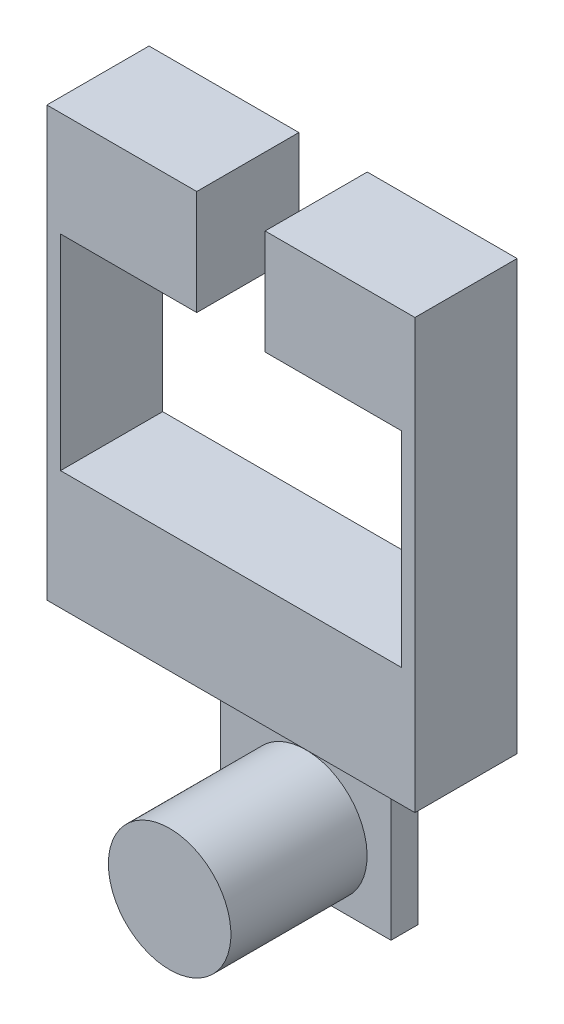
ISO-10303-21;
HEADER;
FILE_DESCRIPTION(('STEP AP214'),'2;1');
FILE_NAME('part.step','',(''),(''),'','','');
FILE_SCHEMA(('AUTOMOTIVE_DESIGN { 1 0 10303 214 1 1 1 1 }'));
ENDSEC;
DATA;
#1=APPLICATION_CONTEXT('core data for automotive mechanical design processes');
#2=APPLICATION_PROTOCOL_DEFINITION('international standard','automotive_design',2000,#1);
#3=PRODUCT_CONTEXT('',#1,'mechanical');
#4=PRODUCT('Part','Part','',(#3));
#5=PRODUCT_RELATED_PRODUCT_CATEGORY('part','',(#4));
#6=PRODUCT_DEFINITION_FORMATION('','',#4);
#7=PRODUCT_DEFINITION_CONTEXT('part definition',#1,'design');
#8=PRODUCT_DEFINITION('design','',#6,#7);
#9=PRODUCT_DEFINITION_SHAPE('','',#8);
#10=(LENGTH_UNIT() NAMED_UNIT(*) SI_UNIT(.MILLI.,.METRE.));
#11=(NAMED_UNIT(*) PLANE_ANGLE_UNIT() SI_UNIT($,.RADIAN.));
#12=(NAMED_UNIT(*) SI_UNIT($,.STERADIAN.) SOLID_ANGLE_UNIT());
#13=UNCERTAINTY_MEASURE_WITH_UNIT(LENGTH_MEASURE(1.E-05),#10,'distance_accuracy_value','');
#14=(GEOMETRIC_REPRESENTATION_CONTEXT(3) GLOBAL_UNCERTAINTY_ASSIGNED_CONTEXT((#13)) GLOBAL_UNIT_ASSIGNED_CONTEXT((#10,
#11,#12)) REPRESENTATION_CONTEXT('',''));
#15=CARTESIAN_POINT('',(0.,0.,0.));
#16=DIRECTION('',(0.,0.,1.));
#17=DIRECTION('',(1.,0.,0.));
#18=AXIS2_PLACEMENT_3D('',#15,#16,#17);
#19=CARTESIAN_POINT('',(-34.32048,0.,9.525));
#20=DIRECTION('',(0.,1.,0.));
#21=DIRECTION('',(0.,0.,1.));
#22=AXIS2_PLACEMENT_3D('',#19,#20,#21);
#23=PLANE('',#22);
#24=DIRECTION('',(0.,0.,-1.));
#25=VECTOR('',#24,1.);
#26=CARTESIAN_POINT('',(-15.875,0.,-4.445));
#27=LINE('',#26,#25);
#28=CARTESIAN_POINT('',(-15.875,0.,-4.445));
#29=VERTEX_POINT('',#28);
#30=CARTESIAN_POINT('',(-15.875,0.,-9.525));
#31=VERTEX_POINT('',#30);
#32=EDGE_CURVE('E193',#29,#31,#27,.T.);
#33=ORIENTED_EDGE('',*,*,#32,.F.);
#34=DIRECTION('',(1.,0.,0.));
#35=VECTOR('',#34,1.);
#36=CARTESIAN_POINT('',(15.875,0.,-4.445));
#37=LINE('',#36,#35);
#38=CARTESIAN_POINT('',(15.875,0.,-4.445));
#39=VERTEX_POINT('',#38);
#40=EDGE_CURVE('E166',#29,#39,#37,.T.);
#41=ORIENTED_EDGE('',*,*,#40,.T.);
#42=DIRECTION('',(0.,0.,-1.));
#43=VECTOR('',#42,1.);
#44=CARTESIAN_POINT('',(15.875,0.,-4.445));
#45=LINE('',#44,#43);
#46=CARTESIAN_POINT('',(15.875,0.,-9.525));
#47=VERTEX_POINT('',#46);
#48=EDGE_CURVE('E179',#39,#47,#45,.T.);
#49=ORIENTED_EDGE('',*,*,#48,.T.);
#50=DIRECTION('',(1.,0.,0.));
#51=VECTOR('',#50,1.);
#52=CARTESIAN_POINT('',(-34.32048,0.,-9.525));
#53=LINE('',#52,#51);
#54=CARTESIAN_POINT('',(34.32048,0.,-9.525));
#55=VERTEX_POINT('',#54);
#56=EDGE_CURVE('E266',#47,#55,#53,.T.);
#57=ORIENTED_EDGE('',*,*,#56,.T.);
#58=DIRECTION('',(0.,0.,-1.));
#59=VECTOR('',#58,1.);
#60=CARTESIAN_POINT('',(34.32048,0.,9.525));
#61=LINE('',#60,#59);
#62=CARTESIAN_POINT('',(34.32048,0.,9.525));
#63=VERTEX_POINT('',#62);
#64=EDGE_CURVE('E52',#63,#55,#61,.T.);
#65=ORIENTED_EDGE('',*,*,#64,.F.);
#66=DIRECTION('',(1.,0.,0.));
#67=VECTOR('',#66,1.);
#68=CARTESIAN_POINT('',(-34.32048,0.,9.525));
#69=LINE('',#68,#67);
#70=CARTESIAN_POINT('',(-34.32048,0.,9.525));
#71=VERTEX_POINT('',#70);
#72=EDGE_CURVE('E254',#71,#63,#69,.T.);
#73=ORIENTED_EDGE('',*,*,#72,.F.);
#74=DIRECTION('',(0.,0.,-1.));
#75=VECTOR('',#74,1.);
#76=CARTESIAN_POINT('',(-34.32048,0.,9.525));
#77=LINE('',#76,#75);
#78=CARTESIAN_POINT('',(-34.32048,0.,-9.525));
#79=VERTEX_POINT('',#78);
#80=EDGE_CURVE('E11',#71,#79,#77,.T.);
#81=ORIENTED_EDGE('',*,*,#80,.T.);
#82=EDGE_CURVE('E267',#79,#31,#53,.T.);
#83=ORIENTED_EDGE('',*,*,#82,.T.);
#84=EDGE_LOOP('',(#33,#41,#49,#57,#65,#73,#81,#83));
#85=FACE_BOUND('',#84,.T.);
#86=ADVANCED_FACE('F43',(#85),#23,.F.);
#87=CARTESIAN_POINT('',(-34.32048,79.9750208357062,9.525));
#88=DIRECTION('',(0.,-1.,0.));
#89=DIRECTION('',(0.,0.,-1.));
#90=AXIS2_PLACEMENT_3D('',#87,#88,#89);
#91=PLANE('',#90);
#92=DIRECTION('',(-1.,0.,0.));
#93=VECTOR('',#92,1.);
#94=CARTESIAN_POINT('',(-34.32048,79.9750208357062,9.525));
#95=LINE('',#94,#93);
#96=CARTESIAN_POINT('',(-6.3754,79.9750208357062,9.525));
#97=VERTEX_POINT('',#96);
#98=CARTESIAN_POINT('',(-34.32048,79.9750208357062,9.525));
#99=VERTEX_POINT('',#98);
#100=EDGE_CURVE('E259',#97,#99,#95,.T.);
#101=ORIENTED_EDGE('',*,*,#100,.F.);
#102=DIRECTION('',(0.,0.,1.));
#103=VECTOR('',#102,1.);
#104=CARTESIAN_POINT('',(-6.3754,79.9750208357062,-9.525));
#105=LINE('',#104,#103);
#106=CARTESIAN_POINT('',(-6.3754,79.9750208357062,-9.525));
#107=VERTEX_POINT('',#106);
#108=EDGE_CURVE('E206',#107,#97,#105,.T.);
#109=ORIENTED_EDGE('',*,*,#108,.F.);
#110=DIRECTION('',(-1.,0.,0.));
#111=VECTOR('',#110,1.);
#112=CARTESIAN_POINT('',(-34.32048,79.9750208357062,-9.525));
#113=LINE('',#112,#111);
#114=CARTESIAN_POINT('',(-34.32048,79.9750208357062,-9.525));
#115=VERTEX_POINT('',#114);
#116=EDGE_CURVE('E272',#107,#115,#113,.T.);
#117=ORIENTED_EDGE('',*,*,#116,.T.);
#118=DIRECTION('',(0.,0.,-1.));
#119=VECTOR('',#118,1.);
#120=CARTESIAN_POINT('',(-34.32048,79.9750208357062,9.525));
#121=LINE('',#120,#119);
#122=EDGE_CURVE('E263',#99,#115,#121,.T.);
#123=ORIENTED_EDGE('',*,*,#122,.F.);
#124=EDGE_LOOP('',(#101,#109,#117,#123));
#125=FACE_BOUND('',#124,.T.);
#126=ADVANCED_FACE('F324',(#125),#91,.F.);
#127=CARTESIAN_POINT('',(-31.78048,60.4170208357062,-9.525));
#128=DIRECTION('',(0.,1.,0.));
#129=DIRECTION('',(-1.,0.,0.));
#130=AXIS2_PLACEMENT_3D('',#127,#128,#129);
#131=PLANE('',#130);
#132=DIRECTION('',(-1.,0.,0.));
#133=VECTOR('',#132,1.);
#134=CARTESIAN_POINT('',(-31.78048,60.4170208357062,-9.525));
#135=LINE('',#134,#133);
#136=CARTESIAN_POINT('',(-6.3754,60.4170208357062,-9.525));
#137=VERTEX_POINT('',#136);
#138=CARTESIAN_POINT('',(-31.78048,60.4170208357062,-9.525));
#139=VERTEX_POINT('',#138);
#140=EDGE_CURVE('E226',#137,#139,#135,.T.);
#141=ORIENTED_EDGE('',*,*,#140,.F.);
#142=DIRECTION('',(0.,0.,1.));
#143=VECTOR('',#142,1.);
#144=CARTESIAN_POINT('',(-6.3754,60.4170208357062,-9.525));
#145=LINE('',#144,#143);
#146=CARTESIAN_POINT('',(-6.3754,60.4170208357062,9.525));
#147=VERTEX_POINT('',#146);
#148=EDGE_CURVE('E203',#137,#147,#145,.T.);
#149=ORIENTED_EDGE('',*,*,#148,.T.);
#150=DIRECTION('',(-1.,0.,0.));
#151=VECTOR('',#150,1.);
#152=CARTESIAN_POINT('',(-31.78048,60.4170208357062,9.525));
#153=LINE('',#152,#151);
#154=CARTESIAN_POINT('',(-31.78048,60.4170208357062,9.525));
#155=VERTEX_POINT('',#154);
#156=EDGE_CURVE('E238',#147,#155,#153,.T.);
#157=ORIENTED_EDGE('',*,*,#156,.T.);
#158=DIRECTION('',(0.,0.,1.));
#159=VECTOR('',#158,1.);
#160=CARTESIAN_POINT('',(-31.78048,60.4170208357062,-9.525));
#161=LINE('',#160,#159);
#162=EDGE_CURVE('E241',#139,#155,#161,.T.);
#163=ORIENTED_EDGE('',*,*,#162,.F.);
#164=EDGE_LOOP('',(#141,#149,#157,#163));
#165=FACE_BOUND('',#164,.T.);
#166=ADVANCED_FACE('F329',(#165),#131,.F.);
#167=CARTESIAN_POINT('',(-34.32048,79.9750208357062,9.525));
#168=DIRECTION('',(1.,0.,0.));
#169=DIRECTION('',(0.,1.,0.));
#170=AXIS2_PLACEMENT_3D('',#167,#168,#169);
#171=PLANE('',#170);
#172=DIRECTION('',(0.,-1.,0.));
#173=VECTOR('',#172,1.);
#174=CARTESIAN_POINT('',(-34.32048,79.9750208357062,-9.525));
#175=LINE('',#174,#173);
#176=EDGE_CURVE('E244',#115,#79,#175,.T.);
#177=ORIENTED_EDGE('',*,*,#176,.T.);
#178=ORIENTED_EDGE('',*,*,#80,.F.);
#179=DIRECTION('',(0.,-1.,0.));
#180=VECTOR('',#179,1.);
#181=CARTESIAN_POINT('',(-34.32048,79.9750208357062,9.525));
#182=LINE('',#181,#180);
#183=EDGE_CURVE('E251',#99,#71,#182,.T.);
#184=ORIENTED_EDGE('',*,*,#183,.F.);
#185=ORIENTED_EDGE('',*,*,#122,.T.);
#186=EDGE_LOOP('',(#177,#178,#184,#185));
#187=FACE_BOUND('',#186,.T.);
#188=ADVANCED_FACE('F45',(#187),#171,.F.);
#189=CARTESIAN_POINT('',(34.32048,79.9750208357062,9.525));
#190=DIRECTION('',(-1.,0.,0.));
#191=DIRECTION('',(0.,-1.,0.));
#192=AXIS2_PLACEMENT_3D('',#189,#190,#191);
#193=PLANE('',#192);
#194=DIRECTION('',(0.,1.,0.));
#195=VECTOR('',#194,1.);
#196=CARTESIAN_POINT('',(34.32048,79.9750208357062,-9.525));
#197=LINE('',#196,#195);
#198=CARTESIAN_POINT('',(34.32048,79.9750208357062,-9.525));
#199=VERTEX_POINT('',#198);
#200=EDGE_CURVE('E270',#55,#199,#197,.T.);
#201=ORIENTED_EDGE('',*,*,#200,.T.);
#202=DIRECTION('',(0.,0.,-1.));
#203=VECTOR('',#202,1.);
#204=CARTESIAN_POINT('',(34.32048,79.9750208357062,9.525));
#205=LINE('',#204,#203);
#206=CARTESIAN_POINT('',(34.32048,79.9750208357062,9.525));
#207=VERTEX_POINT('',#206);
#208=EDGE_CURVE('E277',#207,#199,#205,.T.);
#209=ORIENTED_EDGE('',*,*,#208,.F.);
#210=DIRECTION('',(0.,1.,0.));
#211=VECTOR('',#210,1.);
#212=CARTESIAN_POINT('',(34.32048,79.9750208357062,9.525));
#213=LINE('',#212,#211);
#214=EDGE_CURVE('E257',#63,#207,#213,.T.);
#215=ORIENTED_EDGE('',*,*,#214,.F.);
#216=ORIENTED_EDGE('',*,*,#64,.T.);
#217=EDGE_LOOP('',(#201,#209,#215,#216));
#218=FACE_BOUND('',#217,.T.);
#219=ADVANCED_FACE('F285',(#218),#193,.F.);
#220=CARTESIAN_POINT('',(6.3754,79.9750208357062,-9.525));
#221=VERTEX_POINT('',#220);
#222=EDGE_CURVE('E255',#199,#221,#113,.T.);
#223=ORIENTED_EDGE('',*,*,#222,.T.);
#224=DIRECTION('',(0.,0.,1.));
#225=VECTOR('',#224,1.);
#226=CARTESIAN_POINT('',(6.3754,79.9750208357062,-9.525));
#227=LINE('',#226,#225);
#228=CARTESIAN_POINT('',(6.3754,79.9750208357062,9.525));
#229=VERTEX_POINT('',#228);
#230=EDGE_CURVE('E209',#221,#229,#227,.T.);
#231=ORIENTED_EDGE('',*,*,#230,.T.);
#232=EDGE_CURVE('E260',#207,#229,#95,.T.);
#233=ORIENTED_EDGE('',*,*,#232,.F.);
#234=ORIENTED_EDGE('',*,*,#208,.T.);
#235=EDGE_LOOP('',(#223,#231,#233,#234));
#236=FACE_BOUND('',#235,.T.);
#237=ADVANCED_FACE('F293',(#236),#91,.F.);
#238=CARTESIAN_POINT('',(0.,0.,9.525));
#239=DIRECTION('',(0.,0.,1.));
#240=DIRECTION('',(1.,0.,0.));
#241=AXIS2_PLACEMENT_3D('',#238,#239,#240);
#242=PLANE('',#241);
#243=DIRECTION('',(0.,-1.,0.));
#244=VECTOR('',#243,1.);
#245=CARTESIAN_POINT('',(-6.3754,79.9750208357062,9.525));
#246=LINE('',#245,#244);
#247=EDGE_CURVE('E192',#97,#147,#246,.T.);
#248=ORIENTED_EDGE('',*,*,#247,.F.);
#249=ORIENTED_EDGE('',*,*,#100,.T.);
#250=ORIENTED_EDGE('',*,*,#183,.T.);
#251=ORIENTED_EDGE('',*,*,#72,.T.);
#252=ORIENTED_EDGE('',*,*,#214,.T.);
#253=ORIENTED_EDGE('',*,*,#232,.T.);
#254=DIRECTION('',(0.,1.,0.));
#255=VECTOR('',#254,1.);
#256=CARTESIAN_POINT('',(6.3754,79.9750208357062,9.525));
#257=LINE('',#256,#255);
#258=CARTESIAN_POINT('',(6.3754,60.4170208357062,9.525));
#259=VERTEX_POINT('',#258);
#260=EDGE_CURVE('E200',#259,#229,#257,.T.);
#261=ORIENTED_EDGE('',*,*,#260,.F.);
#262=CARTESIAN_POINT('',(31.78048,60.4170208357062,9.525));
#263=VERTEX_POINT('',#262);
#264=EDGE_CURVE('E220',#263,#259,#153,.T.);
#265=ORIENTED_EDGE('',*,*,#264,.F.);
#266=DIRECTION('',(0.,1.,0.));
#267=VECTOR('',#266,1.);
#268=CARTESIAN_POINT('',(31.78048,60.4170208357062,9.525));
#269=LINE('',#268,#267);
#270=CARTESIAN_POINT('',(31.78048,22.1900208357063,9.525));
#271=VERTEX_POINT('',#270);
#272=EDGE_CURVE('E235',#271,#263,#269,.T.);
#273=ORIENTED_EDGE('',*,*,#272,.F.);
#274=DIRECTION('',(1.,0.,0.));
#275=VECTOR('',#274,1.);
#276=CARTESIAN_POINT('',(-31.78048,22.1900208357062,9.525));
#277=LINE('',#276,#275);
#278=CARTESIAN_POINT('',(-31.78048,22.1900208357062,9.525));
#279=VERTEX_POINT('',#278);
#280=EDGE_CURVE('E232',#279,#271,#277,.T.);
#281=ORIENTED_EDGE('',*,*,#280,.F.);
#282=DIRECTION('',(0.,-1.,0.));
#283=VECTOR('',#282,1.);
#284=CARTESIAN_POINT('',(-31.78048,60.4170208357062,9.525));
#285=LINE('',#284,#283);
#286=EDGE_CURVE('E208',#155,#279,#285,.T.);
#287=ORIENTED_EDGE('',*,*,#286,.F.);
#288=ORIENTED_EDGE('',*,*,#156,.F.);
#289=EDGE_LOOP('',(#248,#249,#250,#251,#252,#253,#261,#265,#273,#281,#287,#288));
#290=FACE_BOUND('',#289,.T.);
#291=ADVANCED_FACE('F298',(#290),#242,.T.);
#292=CARTESIAN_POINT('',(0.,0.,-9.525));
#293=DIRECTION('',(0.,0.,1.));
#294=DIRECTION('',(1.,0.,0.));
#295=AXIS2_PLACEMENT_3D('',#292,#293,#294);
#296=PLANE('',#295);
#297=DIRECTION('',(-1.,0.,0.));
#298=VECTOR('',#297,1.);
#299=CARTESIAN_POINT('',(15.875,-36.82365,-9.525));
#300=LINE('',#299,#298);
#301=CARTESIAN_POINT('',(15.875,-36.82365,-9.525));
#302=VERTEX_POINT('',#301);
#303=CARTESIAN_POINT('',(-15.875,-36.82365,-9.525));
#304=VERTEX_POINT('',#303);
#305=EDGE_CURVE('E163',#302,#304,#300,.T.);
#306=ORIENTED_EDGE('',*,*,#305,.T.);
#307=DIRECTION('',(0.,1.,0.));
#308=VECTOR('',#307,1.);
#309=CARTESIAN_POINT('',(-15.875,0.,-9.525));
#310=LINE('',#309,#308);
#311=EDGE_CURVE('E180',#304,#31,#310,.T.);
#312=ORIENTED_EDGE('',*,*,#311,.T.);
#313=ORIENTED_EDGE('',*,*,#82,.F.);
#314=ORIENTED_EDGE('',*,*,#176,.F.);
#315=ORIENTED_EDGE('',*,*,#116,.F.);
#316=DIRECTION('',(0.,-1.,0.));
#317=VECTOR('',#316,1.);
#318=CARTESIAN_POINT('',(-6.3754,79.9750208357062,-9.525));
#319=LINE('',#318,#317);
#320=EDGE_CURVE('E196',#107,#137,#319,.T.);
#321=ORIENTED_EDGE('',*,*,#320,.T.);
#322=ORIENTED_EDGE('',*,*,#140,.T.);
#323=DIRECTION('',(0.,-1.,0.));
#324=VECTOR('',#323,1.);
#325=CARTESIAN_POINT('',(-31.78048,60.4170208357062,-9.525));
#326=LINE('',#325,#324);
#327=CARTESIAN_POINT('',(-31.78048,22.1900208357062,-9.525));
#328=VERTEX_POINT('',#327);
#329=EDGE_CURVE('E216',#139,#328,#326,.T.);
#330=ORIENTED_EDGE('',*,*,#329,.T.);
#331=DIRECTION('',(1.,0.,0.));
#332=VECTOR('',#331,1.);
#333=CARTESIAN_POINT('',(-31.78048,22.1900208357062,-9.525));
#334=LINE('',#333,#332);
#335=CARTESIAN_POINT('',(31.78048,22.1900208357063,-9.525));
#336=VERTEX_POINT('',#335);
#337=EDGE_CURVE('E219',#328,#336,#334,.T.);
#338=ORIENTED_EDGE('',*,*,#337,.T.);
#339=DIRECTION('',(0.,1.,0.));
#340=VECTOR('',#339,1.);
#341=CARTESIAN_POINT('',(31.78048,60.4170208357062,-9.525));
#342=LINE('',#341,#340);
#343=CARTESIAN_POINT('',(31.78048,60.4170208357062,-9.525));
#344=VERTEX_POINT('',#343);
#345=EDGE_CURVE('E223',#336,#344,#342,.T.);
#346=ORIENTED_EDGE('',*,*,#345,.T.);
#347=CARTESIAN_POINT('',(6.3754,60.4170208357062,-9.525));
#348=VERTEX_POINT('',#347);
#349=EDGE_CURVE('E227',#344,#348,#135,.T.);
#350=ORIENTED_EDGE('',*,*,#349,.T.);
#351=DIRECTION('',(0.,1.,0.));
#352=VECTOR('',#351,1.);
#353=CARTESIAN_POINT('',(6.3754,79.9750208357062,-9.525));
#354=LINE('',#353,#352);
#355=EDGE_CURVE('E199',#348,#221,#354,.T.);
#356=ORIENTED_EDGE('',*,*,#355,.T.);
#357=ORIENTED_EDGE('',*,*,#222,.F.);
#358=ORIENTED_EDGE('',*,*,#200,.F.);
#359=ORIENTED_EDGE('',*,*,#56,.F.);
#360=DIRECTION('',(0.,-1.,0.));
#361=VECTOR('',#360,1.);
#362=CARTESIAN_POINT('',(15.875,0.,-9.525));
#363=LINE('',#362,#361);
#364=EDGE_CURVE('E63',#47,#302,#363,.T.);
#365=ORIENTED_EDGE('',*,*,#364,.T.);
#366=EDGE_LOOP('',(#306,#312,#313,#314,#315,#321,#322,#330,#338,#346,#350,#356,#357,#358,#359,#365));
#367=FACE_BOUND('',#366,.T.);
#368=ADVANCED_FACE('F291',(#367),#296,.F.);
#369=CARTESIAN_POINT('',(-31.78048,60.4170208357062,-9.525));
#370=DIRECTION('',(-1.,0.,0.));
#371=DIRECTION('',(0.,-1.,0.));
#372=AXIS2_PLACEMENT_3D('',#369,#370,#371);
#373=PLANE('',#372);
#374=ORIENTED_EDGE('',*,*,#286,.T.);
#375=DIRECTION('',(0.,0.,1.));
#376=VECTOR('',#375,1.);
#377=CARTESIAN_POINT('',(-31.78048,22.1900208357062,-9.525));
#378=LINE('',#377,#376);
#379=EDGE_CURVE('E230',#328,#279,#378,.T.);
#380=ORIENTED_EDGE('',*,*,#379,.F.);
#381=ORIENTED_EDGE('',*,*,#329,.F.);
#382=ORIENTED_EDGE('',*,*,#162,.T.);
#383=EDGE_LOOP('',(#374,#380,#381,#382));
#384=FACE_BOUND('',#383,.T.);
#385=ADVANCED_FACE('F337',(#384),#373,.F.);
#386=ORIENTED_EDGE('',*,*,#264,.T.);
#387=DIRECTION('',(0.,0.,1.));
#388=VECTOR('',#387,1.);
#389=CARTESIAN_POINT('',(6.3754,60.4170208357062,-9.525));
#390=LINE('',#389,#388);
#391=EDGE_CURVE('E212',#348,#259,#390,.T.);
#392=ORIENTED_EDGE('',*,*,#391,.F.);
#393=ORIENTED_EDGE('',*,*,#349,.F.);
#394=DIRECTION('',(0.,0.,1.));
#395=VECTOR('',#394,1.);
#396=CARTESIAN_POINT('',(31.78048,60.4170208357062,-9.525));
#397=LINE('',#396,#395);
#398=EDGE_CURVE('E245',#344,#263,#397,.T.);
#399=ORIENTED_EDGE('',*,*,#398,.T.);
#400=EDGE_LOOP('',(#386,#392,#393,#399));
#401=FACE_BOUND('',#400,.T.);
#402=ADVANCED_FACE('F342',(#401),#131,.F.);
#403=CARTESIAN_POINT('',(31.78048,60.4170208357062,-9.525));
#404=DIRECTION('',(1.,0.,0.));
#405=DIRECTION('',(0.,1.,0.));
#406=AXIS2_PLACEMENT_3D('',#403,#404,#405);
#407=PLANE('',#406);
#408=ORIENTED_EDGE('',*,*,#272,.T.);
#409=ORIENTED_EDGE('',*,*,#398,.F.);
#410=ORIENTED_EDGE('',*,*,#345,.F.);
#411=DIRECTION('',(0.,0.,1.));
#412=VECTOR('',#411,1.);
#413=CARTESIAN_POINT('',(31.78048,22.1900208357063,-9.525));
#414=LINE('',#413,#412);
#415=EDGE_CURVE('E247',#336,#271,#414,.T.);
#416=ORIENTED_EDGE('',*,*,#415,.T.);
#417=EDGE_LOOP('',(#408,#409,#410,#416));
#418=FACE_BOUND('',#417,.T.);
#419=ADVANCED_FACE('F348',(#418),#407,.F.);
#420=CARTESIAN_POINT('',(-31.78048,22.1900208357062,-9.525));
#421=DIRECTION('',(0.,-1.,0.));
#422=DIRECTION('',(1.,0.,0.));
#423=AXIS2_PLACEMENT_3D('',#420,#421,#422);
#424=PLANE('',#423);
#425=ORIENTED_EDGE('',*,*,#280,.T.);
#426=ORIENTED_EDGE('',*,*,#415,.F.);
#427=ORIENTED_EDGE('',*,*,#337,.F.);
#428=ORIENTED_EDGE('',*,*,#379,.T.);
#429=EDGE_LOOP('',(#425,#426,#427,#428));
#430=FACE_BOUND('',#429,.T.);
#431=ADVANCED_FACE('F344',(#430),#424,.F.);
#432=CARTESIAN_POINT('',(6.3754,79.9750208357062,-9.525));
#433=DIRECTION('',(1.,0.,0.));
#434=DIRECTION('',(0.,1.,0.));
#435=AXIS2_PLACEMENT_3D('',#432,#433,#434);
#436=PLANE('',#435);
#437=ORIENTED_EDGE('',*,*,#260,.T.);
#438=ORIENTED_EDGE('',*,*,#230,.F.);
#439=ORIENTED_EDGE('',*,*,#355,.F.);
#440=ORIENTED_EDGE('',*,*,#391,.T.);
#441=EDGE_LOOP('',(#437,#438,#439,#440));
#442=FACE_BOUND('',#441,.T.);
#443=ADVANCED_FACE('F347',(#442),#436,.F.);
#444=CARTESIAN_POINT('',(-6.3754,79.9750208357062,-9.525));
#445=DIRECTION('',(-1.,0.,0.));
#446=DIRECTION('',(0.,-1.,0.));
#447=AXIS2_PLACEMENT_3D('',#444,#445,#446);
#448=PLANE('',#447);
#449=ORIENTED_EDGE('',*,*,#247,.T.);
#450=ORIENTED_EDGE('',*,*,#148,.F.);
#451=ORIENTED_EDGE('',*,*,#320,.F.);
#452=ORIENTED_EDGE('',*,*,#108,.T.);
#453=EDGE_LOOP('',(#449,#450,#451,#452));
#454=FACE_BOUND('',#453,.T.);
#455=ADVANCED_FACE('F320',(#454),#448,.F.);
#456=CARTESIAN_POINT('',(15.875,0.,-4.445));
#457=DIRECTION('',(1.,0.,0.));
#458=DIRECTION('',(0.,1.,0.));
#459=AXIS2_PLACEMENT_3D('',#456,#457,#458);
#460=PLANE('',#459);
#461=ORIENTED_EDGE('',*,*,#364,.F.);
#462=ORIENTED_EDGE('',*,*,#48,.F.);
#463=DIRECTION('',(0.,-1.,0.));
#464=VECTOR('',#463,1.);
#465=CARTESIAN_POINT('',(15.875,0.,-4.445));
#466=LINE('',#465,#464);
#467=CARTESIAN_POINT('',(15.875,-36.82365,-4.445));
#468=VERTEX_POINT('',#467);
#469=EDGE_CURVE('E173',#39,#468,#466,.T.);
#470=ORIENTED_EDGE('',*,*,#469,.T.);
#471=DIRECTION('',(0.,0.,-1.));
#472=VECTOR('',#471,1.);
#473=CARTESIAN_POINT('',(15.875,-36.82365,-4.445));
#474=LINE('',#473,#472);
#475=EDGE_CURVE('E158',#468,#302,#474,.T.);
#476=ORIENTED_EDGE('',*,*,#475,.T.);
#477=EDGE_LOOP('',(#461,#462,#470,#476));
#478=FACE_BOUND('',#477,.T.);
#479=ADVANCED_FACE('F178',(#478),#460,.T.);
#480=CARTESIAN_POINT('',(-15.875,0.,-4.445));
#481=DIRECTION('',(-1.,0.,0.));
#482=DIRECTION('',(0.,-1.,0.));
#483=AXIS2_PLACEMENT_3D('',#480,#481,#482);
#484=PLANE('',#483);
#485=ORIENTED_EDGE('',*,*,#311,.F.);
#486=DIRECTION('',(0.,0.,-1.));
#487=VECTOR('',#486,1.);
#488=CARTESIAN_POINT('',(-15.875,-36.82365,-4.445));
#489=LINE('',#488,#487);
#490=CARTESIAN_POINT('',(-15.875,-36.82365,-4.445));
#491=VERTEX_POINT('',#490);
#492=EDGE_CURVE('E165',#491,#304,#489,.T.);
#493=ORIENTED_EDGE('',*,*,#492,.F.);
#494=DIRECTION('',(0.,1.,0.));
#495=VECTOR('',#494,1.);
#496=CARTESIAN_POINT('',(-15.875,0.,-4.445));
#497=LINE('',#496,#495);
#498=EDGE_CURVE('E175',#491,#29,#497,.T.);
#499=ORIENTED_EDGE('',*,*,#498,.T.);
#500=ORIENTED_EDGE('',*,*,#32,.T.);
#501=EDGE_LOOP('',(#485,#493,#499,#500));
#502=FACE_BOUND('',#501,.T.);
#503=ADVANCED_FACE('F310',(#502),#484,.T.);
#504=CARTESIAN_POINT('',(15.875,-36.82365,-4.445));
#505=DIRECTION('',(0.,-1.,0.));
#506=DIRECTION('',(0.,0.,-1.));
#507=AXIS2_PLACEMENT_3D('',#504,#505,#506);
#508=PLANE('',#507);
#509=ORIENTED_EDGE('',*,*,#492,.T.);
#510=ORIENTED_EDGE('',*,*,#305,.F.);
#511=ORIENTED_EDGE('',*,*,#475,.F.);
#512=DIRECTION('',(-1.,0.,0.));
#513=VECTOR('',#512,1.);
#514=CARTESIAN_POINT('',(15.875,-36.82365,-4.445));
#515=LINE('',#514,#513);
#516=CARTESIAN_POINT('',(0.,-36.82365,-4.445));
#517=VERTEX_POINT('',#516);
#518=EDGE_CURVE('E162',#468,#517,#515,.T.);
#519=ORIENTED_EDGE('',*,*,#518,.T.);
#520=EDGE_CURVE('E176',#517,#491,#515,.T.);
#521=ORIENTED_EDGE('',*,*,#520,.T.);
#522=EDGE_LOOP('',(#509,#510,#511,#519,#521));
#523=FACE_BOUND('',#522,.T.);
#524=ADVANCED_FACE('F161',(#523),#508,.T.);
#525=CARTESIAN_POINT('',(0.,0.,-4.445));
#526=DIRECTION('',(0.,0.,-1.));
#527=DIRECTION('',(-1.,0.,0.));
#528=AXIS2_PLACEMENT_3D('',#525,#526,#527);
#529=PLANE('',#528);
#530=ORIENTED_EDGE('',*,*,#520,.F.);
#531=CARTESIAN_POINT('',(0.,-25.4,-4.445));
#532=DIRECTION('',(0.,0.,-1.));
#533=DIRECTION('',(-1.,0.,0.));
#534=AXIS2_PLACEMENT_3D('',#531,#532,#533);
#535=CIRCLE('',#534,11.42365);
#536=EDGE_CURVE('E47',#517,#517,#535,.T.);
#537=ORIENTED_EDGE('',*,*,#536,.T.);
#538=ORIENTED_EDGE('',*,*,#518,.F.);
#539=ORIENTED_EDGE('',*,*,#469,.F.);
#540=ORIENTED_EDGE('',*,*,#40,.F.);
#541=ORIENTED_EDGE('',*,*,#498,.F.);
#542=EDGE_LOOP('',(#530,#537,#538,#539,#540,#541));
#543=FACE_BOUND('',#542,.T.);
#544=ADVANCED_FACE('F171',(#543),#529,.F.);
#545=CARTESIAN_POINT('',(0.,-25.4,20.955));
#546=DIRECTION('',(0.,0.,-1.));
#547=DIRECTION('',(-1.,0.,0.));
#548=AXIS2_PLACEMENT_3D('',#545,#546,#547);
#549=CYLINDRICAL_SURFACE('',#548,11.42365);
#550=CARTESIAN_POINT('',(0.,-25.4,20.955));
#551=DIRECTION('',(0.,0.,-1.));
#552=DIRECTION('',(-1.,0.,0.));
#553=AXIS2_PLACEMENT_3D('',#550,#551,#552);
#554=CIRCLE('',#553,11.42365);
#555=CARTESIAN_POINT('',(-11.42365,-25.4,20.955));
#556=VERTEX_POINT('',#555);
#557=EDGE_CURVE('E185',#556,#556,#554,.T.);
#558=ORIENTED_EDGE('',*,*,#557,.T.);
#559=EDGE_LOOP('',(#558));
#560=FACE_BOUND('',#559,.T.);
#561=ORIENTED_EDGE('',*,*,#536,.F.);
#562=EDGE_LOOP('',(#561));
#563=FACE_BOUND('',#562,.T.);
#564=ADVANCED_FACE('F449',(#560,#563),#549,.T.);
#565=CARTESIAN_POINT('',(0.,-25.4,20.955));
#566=DIRECTION('',(0.,0.,-1.));
#567=DIRECTION('',(-1.,0.,0.));
#568=AXIS2_PLACEMENT_3D('',#565,#566,#567);
#569=PLANE('',#568);
#570=ORIENTED_EDGE('',*,*,#557,.F.);
#571=EDGE_LOOP('',(#570));
#572=FACE_BOUND('',#571,.T.);
#573=ADVANCED_FACE('F456',(#572),#569,.F.);
#574=CLOSED_SHELL('',(#86,#126,#166,#188,#219,#237,#291,#368,#385,#402,#419,#431,#443,#455,#479,
#503,#524,#544,#564,#573));
#575=MANIFOLD_SOLID_BREP('B2',#574);
#576=ADVANCED_BREP_SHAPE_REPRESENTATION('',(#18,#575),#14);
#577=SHAPE_DEFINITION_REPRESENTATION(#9,#576);
ENDSEC;
END-ISO-10303-21;
